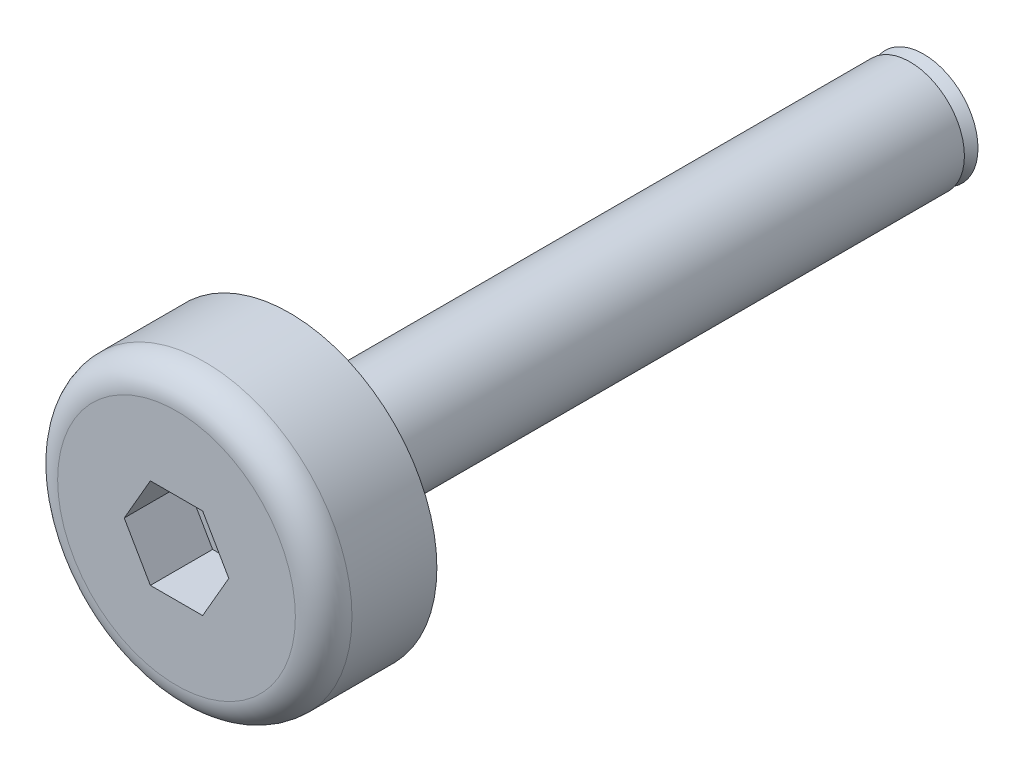
ISO-10303-21;
HEADER;
FILE_DESCRIPTION(('STEP AP214'),'2;1');
FILE_NAME('part.step','',(''),(''),'','','');
FILE_SCHEMA(('AUTOMOTIVE_DESIGN { 1 0 10303 214 1 1 1 1 }'));
ENDSEC;
DATA;
#1=APPLICATION_CONTEXT('core data for automotive mechanical design processes');
#2=APPLICATION_PROTOCOL_DEFINITION('international standard','automotive_design',2000,#1);
#3=PRODUCT_CONTEXT('',#1,'mechanical');
#4=PRODUCT('Part','Part','',(#3));
#5=PRODUCT_RELATED_PRODUCT_CATEGORY('part','',(#4));
#6=PRODUCT_DEFINITION_FORMATION('','',#4);
#7=PRODUCT_DEFINITION_CONTEXT('part definition',#1,'design');
#8=PRODUCT_DEFINITION('design','',#6,#7);
#9=PRODUCT_DEFINITION_SHAPE('','',#8);
#10=(LENGTH_UNIT() NAMED_UNIT(*) SI_UNIT(.MILLI.,.METRE.));
#11=(NAMED_UNIT(*) PLANE_ANGLE_UNIT() SI_UNIT($,.RADIAN.));
#12=(NAMED_UNIT(*) SI_UNIT($,.STERADIAN.) SOLID_ANGLE_UNIT());
#13=UNCERTAINTY_MEASURE_WITH_UNIT(LENGTH_MEASURE(1.E-05),#10,'distance_accuracy_value','');
#14=(GEOMETRIC_REPRESENTATION_CONTEXT(3) GLOBAL_UNCERTAINTY_ASSIGNED_CONTEXT((#13)) GLOBAL_UNIT_ASSIGNED_CONTEXT((#10,
#11,#12)) REPRESENTATION_CONTEXT('',''));
#15=CARTESIAN_POINT('',(0.,0.,0.));
#16=DIRECTION('',(0.,0.,1.));
#17=DIRECTION('',(1.,0.,0.));
#18=AXIS2_PLACEMENT_3D('',#15,#16,#17);
#19=CARTESIAN_POINT('',(0.,0.,-14.));
#20=DIRECTION('',(0.,0.,1.));
#21=DIRECTION('',(1.,0.,0.));
#22=AXIS2_PLACEMENT_3D('',#19,#20,#21);
#23=PLANE('',#22);
#24=CARTESIAN_POINT('',(0.,0.,-14.));
#25=DIRECTION('',(0.,0.,1.));
#26=DIRECTION('',(1.,0.,0.));
#27=AXIS2_PLACEMENT_3D('',#24,#25,#26);
#28=CIRCLE('',#27,1.2);
#29=CARTESIAN_POINT('',(1.2,0.,-14.));
#30=VERTEX_POINT('',#29);
#31=EDGE_CURVE('E9',#30,#30,#28,.T.);
#32=ORIENTED_EDGE('',*,*,#31,.F.);
#33=EDGE_LOOP('',(#32));
#34=FACE_BOUND('',#33,.T.);
#35=ADVANCED_FACE('F14',(#34),#23,.F.);
#36=CARTESIAN_POINT('',(0.,0.,-14.));
#37=DIRECTION('',(0.,0.,-1.));
#38=DIRECTION('',(1.,0.,0.));
#39=AXIS2_PLACEMENT_3D('',#36,#37,#38);
#40=CONICAL_SURFACE('',#39,1.2,0.785398163397);
#41=CARTESIAN_POINT('',(0.,0.,-13.7));
#42=DIRECTION('',(0.,0.,1.));
#43=DIRECTION('',(1.,0.,0.));
#44=AXIS2_PLACEMENT_3D('',#41,#42,#43);
#45=CIRCLE('',#44,0.9);
#46=CARTESIAN_POINT('',(0.9,0.,-13.7));
#47=VERTEX_POINT('',#46);
#48=EDGE_CURVE('E148',#47,#47,#45,.T.);
#49=ORIENTED_EDGE('',*,*,#48,.F.);
#50=DIRECTION('',(-0.707106781186548,0.,0.707106781186548));
#51=VECTOR('',#50,1.);
#52=CARTESIAN_POINT('',(1.2,0.,-14.));
#53=LINE('',#52,#51);
#54=EDGE_CURVE('E25',#30,#47,#53,.T.);
#55=ORIENTED_EDGE('',*,*,#54,.F.);
#56=ORIENTED_EDGE('',*,*,#31,.T.);
#57=ORIENTED_EDGE('',*,*,#54,.T.);
#58=EDGE_LOOP('',(#49,#55,#56,#57));
#59=FACE_BOUND('',#58,.T.);
#60=ADVANCED_FACE('F262',(#59),#40,.T.);
#61=CARTESIAN_POINT('',(0.,0.,1.125));
#62=DIRECTION('',(0.,0.,1.));
#63=DIRECTION('',(1.,0.,0.));
#64=AXIS2_PLACEMENT_3D('',#61,#62,#63);
#65=PLANE('',#64);
#66=DIRECTION('',(-0.50000000000019,0.866025403784329,0.));
#67=VECTOR('',#66,1.);
#68=CARTESIAN_POINT('',(1.154700538379,0.,1.125));
#69=LINE('',#68,#67);
#70=CARTESIAN_POINT('',(1.154700538379,0.,1.125));
#71=VERTEX_POINT('',#70);
#72=CARTESIAN_POINT('',(0.57735026919,1.,1.125));
#73=VERTEX_POINT('',#72);
#74=EDGE_CURVE('E145',#71,#73,#69,.T.);
#75=ORIENTED_EDGE('',*,*,#74,.T.);
#76=DIRECTION('',(-1.,0.,0.));
#77=VECTOR('',#76,1.);
#78=CARTESIAN_POINT('',(0.57735026919,1.,1.125));
#79=LINE('',#78,#77);
#80=CARTESIAN_POINT('',(-0.57735026919,1.,1.125));
#81=VERTEX_POINT('',#80);
#82=EDGE_CURVE('E178',#73,#81,#79,.T.);
#83=ORIENTED_EDGE('',*,*,#82,.T.);
#84=DIRECTION('',(-0.50000000000019,-0.866025403784329,0.));
#85=VECTOR('',#84,1.);
#86=CARTESIAN_POINT('',(-0.57735026919,1.,1.125));
#87=LINE('',#86,#85);
#88=CARTESIAN_POINT('',(-1.154700538379,0.,1.125));
#89=VERTEX_POINT('',#88);
#90=EDGE_CURVE('E193',#81,#89,#87,.T.);
#91=ORIENTED_EDGE('',*,*,#90,.T.);
#92=DIRECTION('',(0.50000000000019,-0.866025403784329,0.));
#93=VECTOR('',#92,1.);
#94=CARTESIAN_POINT('',(-1.154700538379,0.,1.125));
#95=LINE('',#94,#93);
#96=CARTESIAN_POINT('',(-0.57735026919,-1.,1.125));
#97=VERTEX_POINT('',#96);
#98=EDGE_CURVE('E189',#89,#97,#95,.T.);
#99=ORIENTED_EDGE('',*,*,#98,.T.);
#100=DIRECTION('',(1.,0.,0.));
#101=VECTOR('',#100,1.);
#102=CARTESIAN_POINT('',(-0.57735026919,-1.,1.125));
#103=LINE('',#102,#101);
#104=CARTESIAN_POINT('',(0.57735026919,-1.,1.125));
#105=VERTEX_POINT('',#104);
#106=EDGE_CURVE('E117',#97,#105,#103,.T.);
#107=ORIENTED_EDGE('',*,*,#106,.T.);
#108=DIRECTION('',(0.50000000000019,0.866025403784329,0.));
#109=VECTOR('',#108,1.);
#110=CARTESIAN_POINT('',(0.57735026919,-1.,1.125));
#111=LINE('',#110,#109);
#112=EDGE_CURVE('E112',#105,#71,#111,.T.);
#113=ORIENTED_EDGE('',*,*,#112,.T.);
#114=EDGE_LOOP('',(#75,#83,#91,#99,#107,#113));
#115=FACE_BOUND('',#114,.T.);
#116=ADVANCED_FACE('F216',(#115),#65,.T.);
#117=CARTESIAN_POINT('',(0.,0.,-13.7));
#118=DIRECTION('',(0.,0.,1.));
#119=DIRECTION('',(1.,0.,0.));
#120=AXIS2_PLACEMENT_3D('',#117,#118,#119);
#121=PLANE('',#120);
#122=ORIENTED_EDGE('',*,*,#48,.T.);
#123=EDGE_LOOP('',(#122));
#124=FACE_BOUND('',#123,.T.);
#125=CARTESIAN_POINT('',(0.,0.,-13.7));
#126=DIRECTION('',(0.,0.,1.));
#127=DIRECTION('',(1.,0.,0.));
#128=AXIS2_PLACEMENT_3D('',#125,#126,#127);
#129=CIRCLE('',#128,1.2);
#130=CARTESIAN_POINT('',(1.2,0.,-13.7));
#131=VERTEX_POINT('',#130);
#132=EDGE_CURVE('E194',#131,#131,#129,.T.);
#133=ORIENTED_EDGE('',*,*,#132,.F.);
#134=EDGE_LOOP('',(#133));
#135=FACE_BOUND('',#134,.T.);
#136=ADVANCED_FACE('F272',(#124,#135),#121,.F.);
#137=CARTESIAN_POINT('',(1.154700538379,0.,1.125));
#138=DIRECTION('',(-0.866025403784329,-0.50000000000019,0.));
#139=DIRECTION('',(-0.50000000000019,0.866025403784329,0.));
#140=AXIS2_PLACEMENT_3D('',#137,#138,#139);
#141=PLANE('',#140);
#142=ORIENTED_EDGE('',*,*,#74,.F.);
#143=DIRECTION('',(0.,0.,1.));
#144=VECTOR('',#143,1.);
#145=CARTESIAN_POINT('',(1.154700538379,0.,1.125));
#146=LINE('',#145,#144);
#147=CARTESIAN_POINT('',(1.154700538379,0.,2.5));
#148=VERTEX_POINT('',#147);
#149=EDGE_CURVE('E143',#71,#148,#146,.T.);
#150=ORIENTED_EDGE('',*,*,#149,.T.);
#151=DIRECTION('',(0.50000000000019,-0.866025403784329,0.));
#152=VECTOR('',#151,1.);
#153=CARTESIAN_POINT('',(1.010362971082,0.25,2.5));
#154=LINE('',#153,#152);
#155=CARTESIAN_POINT('',(0.57735026919,1.,2.5));
#156=VERTEX_POINT('',#155);
#157=EDGE_CURVE('E134',#156,#148,#154,.T.);
#158=ORIENTED_EDGE('',*,*,#157,.F.);
#159=DIRECTION('',(0.,0.,1.));
#160=VECTOR('',#159,1.);
#161=CARTESIAN_POINT('',(0.57735026919,1.,1.125));
#162=LINE('',#161,#160);
#163=EDGE_CURVE('E174',#73,#156,#162,.T.);
#164=ORIENTED_EDGE('',*,*,#163,.F.);
#165=EDGE_LOOP('',(#142,#150,#158,#164));
#166=FACE_BOUND('',#165,.T.);
#167=ADVANCED_FACE('F281',(#166),#141,.T.);
#168=CARTESIAN_POINT('',(0.57735026919,-1.,1.125));
#169=DIRECTION('',(-0.866025403784329,0.50000000000019,0.));
#170=DIRECTION('',(0.,0.,1.));
#171=AXIS2_PLACEMENT_3D('',#168,#169,#170);
#172=PLANE('',#171);
#173=ORIENTED_EDGE('',*,*,#112,.F.);
#174=DIRECTION('',(0.,0.,1.));
#175=VECTOR('',#174,1.);
#176=CARTESIAN_POINT('',(0.57735026919,-1.,1.125));
#177=LINE('',#176,#175);
#178=CARTESIAN_POINT('',(0.57735026919,-1.,2.5));
#179=VERTEX_POINT('',#178);
#180=EDGE_CURVE('E104',#105,#179,#177,.T.);
#181=ORIENTED_EDGE('',*,*,#180,.T.);
#182=DIRECTION('',(-0.50000000000019,-0.866025403784329,0.));
#183=VECTOR('',#182,1.);
#184=CARTESIAN_POINT('',(0.721687836487,-0.75,2.5));
#185=LINE('',#184,#183);
#186=EDGE_CURVE('E109',#148,#179,#185,.T.);
#187=ORIENTED_EDGE('',*,*,#186,.F.);
#188=ORIENTED_EDGE('',*,*,#149,.F.);
#189=EDGE_LOOP('',(#173,#181,#187,#188));
#190=FACE_BOUND('',#189,.T.);
#191=ADVANCED_FACE('F106',(#190),#172,.T.);
#192=CARTESIAN_POINT('',(-0.57735026919,-1.,1.125));
#193=DIRECTION('',(0.,1.,0.));
#194=DIRECTION('',(1.,0.,0.));
#195=AXIS2_PLACEMENT_3D('',#192,#193,#194);
#196=PLANE('',#195);
#197=ORIENTED_EDGE('',*,*,#106,.F.);
#198=DIRECTION('',(0.,0.,1.));
#199=VECTOR('',#198,1.);
#200=CARTESIAN_POINT('',(-0.57735026919,-1.,1.125));
#201=LINE('',#200,#199);
#202=CARTESIAN_POINT('',(-0.57735026919,-1.,2.5));
#203=VERTEX_POINT('',#202);
#204=EDGE_CURVE('E123',#97,#203,#201,.T.);
#205=ORIENTED_EDGE('',*,*,#204,.T.);
#206=DIRECTION('',(-1.,0.,0.));
#207=VECTOR('',#206,1.);
#208=CARTESIAN_POINT('',(-0.288675134595,-1.,2.5));
#209=LINE('',#208,#207);
#210=EDGE_CURVE('E120',#179,#203,#209,.T.);
#211=ORIENTED_EDGE('',*,*,#210,.F.);
#212=ORIENTED_EDGE('',*,*,#180,.F.);
#213=EDGE_LOOP('',(#197,#205,#211,#212));
#214=FACE_BOUND('',#213,.T.);
#215=ADVANCED_FACE('F121',(#214),#196,.T.);
#216=CARTESIAN_POINT('',(-1.154700538379,0.,1.125));
#217=DIRECTION('',(0.866025403784329,0.50000000000019,0.));
#218=DIRECTION('',(0.,0.,-1.));
#219=AXIS2_PLACEMENT_3D('',#216,#217,#218);
#220=PLANE('',#219);
#221=ORIENTED_EDGE('',*,*,#98,.F.);
#222=DIRECTION('',(0.,0.,1.));
#223=VECTOR('',#222,1.);
#224=CARTESIAN_POINT('',(-1.154700538379,0.,1.125));
#225=LINE('',#224,#223);
#226=CARTESIAN_POINT('',(-1.154700538379,0.,2.5));
#227=VERTEX_POINT('',#226);
#228=EDGE_CURVE('E190',#89,#227,#225,.T.);
#229=ORIENTED_EDGE('',*,*,#228,.T.);
#230=DIRECTION('',(-0.50000000000019,0.866025403784329,0.));
#231=VECTOR('',#230,1.);
#232=CARTESIAN_POINT('',(-1.010362971082,-0.25,2.5));
#233=LINE('',#232,#231);
#234=EDGE_CURVE('E128',#203,#227,#233,.T.);
#235=ORIENTED_EDGE('',*,*,#234,.F.);
#236=ORIENTED_EDGE('',*,*,#204,.F.);
#237=EDGE_LOOP('',(#221,#229,#235,#236));
#238=FACE_BOUND('',#237,.T.);
#239=ADVANCED_FACE('F274',(#238),#220,.T.);
#240=CARTESIAN_POINT('',(-0.57735026919,1.,1.125));
#241=DIRECTION('',(0.866025403784329,-0.50000000000019,0.));
#242=DIRECTION('',(0.,0.,-1.));
#243=AXIS2_PLACEMENT_3D('',#240,#241,#242);
#244=PLANE('',#243);
#245=ORIENTED_EDGE('',*,*,#90,.F.);
#246=DIRECTION('',(0.,0.,1.));
#247=VECTOR('',#246,1.);
#248=CARTESIAN_POINT('',(-0.57735026919,1.,1.125));
#249=LINE('',#248,#247);
#250=CARTESIAN_POINT('',(-0.57735026919,1.,2.5));
#251=VERTEX_POINT('',#250);
#252=EDGE_CURVE('E177',#81,#251,#249,.T.);
#253=ORIENTED_EDGE('',*,*,#252,.T.);
#254=DIRECTION('',(0.50000000000019,0.866025403784329,0.));
#255=VECTOR('',#254,1.);
#256=CARTESIAN_POINT('',(-0.721687836487,0.75,2.5));
#257=LINE('',#256,#255);
#258=EDGE_CURVE('E181',#227,#251,#257,.T.);
#259=ORIENTED_EDGE('',*,*,#258,.F.);
#260=ORIENTED_EDGE('',*,*,#228,.F.);
#261=EDGE_LOOP('',(#245,#253,#259,#260));
#262=FACE_BOUND('',#261,.T.);
#263=ADVANCED_FACE('F225',(#262),#244,.T.);
#264=CARTESIAN_POINT('',(0.57735026919,1.,1.125));
#265=DIRECTION('',(0.,-1.,0.));
#266=DIRECTION('',(-1.,0.,0.));
#267=AXIS2_PLACEMENT_3D('',#264,#265,#266);
#268=PLANE('',#267);
#269=ORIENTED_EDGE('',*,*,#82,.F.);
#270=ORIENTED_EDGE('',*,*,#163,.T.);
#271=DIRECTION('',(1.,0.,0.));
#272=VECTOR('',#271,1.);
#273=CARTESIAN_POINT('',(0.288675134595,1.,2.5));
#274=LINE('',#273,#272);
#275=EDGE_CURVE('E18',#251,#156,#274,.T.);
#276=ORIENTED_EDGE('',*,*,#275,.F.);
#277=ORIENTED_EDGE('',*,*,#252,.F.);
#278=EDGE_LOOP('',(#269,#270,#276,#277));
#279=FACE_BOUND('',#278,.T.);
#280=ADVANCED_FACE('F16',(#279),#268,.T.);
#281=CARTESIAN_POINT('',(0.,0.,-13.7));
#282=DIRECTION('',(0.,0.,1.));
#283=DIRECTION('',(1.,0.,0.));
#284=AXIS2_PLACEMENT_3D('',#281,#282,#283);
#285=CYLINDRICAL_SURFACE('',#284,1.2);
#286=CARTESIAN_POINT('',(0.,0.,0.));
#287=DIRECTION('',(0.,0.,1.));
#288=DIRECTION('',(1.,0.,0.));
#289=AXIS2_PLACEMENT_3D('',#286,#287,#288);
#290=CIRCLE('',#289,1.2);
#291=CARTESIAN_POINT('',(1.2,0.,0.));
#292=VERTEX_POINT('',#291);
#293=EDGE_CURVE('E185',#292,#292,#290,.T.);
#294=ORIENTED_EDGE('',*,*,#293,.F.);
#295=DIRECTION('',(0.,0.,1.));
#296=VECTOR('',#295,1.);
#297=CARTESIAN_POINT('',(1.2,0.,-13.7));
#298=LINE('',#297,#296);
#299=EDGE_CURVE('E197',#131,#292,#298,.T.);
#300=ORIENTED_EDGE('',*,*,#299,.F.);
#301=ORIENTED_EDGE('',*,*,#132,.T.);
#302=ORIENTED_EDGE('',*,*,#299,.T.);
#303=EDGE_LOOP('',(#294,#300,#301,#302));
#304=FACE_BOUND('',#303,.T.);
#305=ADVANCED_FACE('F257',(#304),#285,.T.);
#306=CARTESIAN_POINT('',(0.,0.,2.5));
#307=DIRECTION('',(0.,0.,1.));
#308=DIRECTION('',(1.,0.,0.));
#309=AXIS2_PLACEMENT_3D('',#306,#307,#308);
#310=PLANE('',#309);
#311=ORIENTED_EDGE('',*,*,#275,.T.);
#312=ORIENTED_EDGE('',*,*,#157,.T.);
#313=ORIENTED_EDGE('',*,*,#186,.T.);
#314=ORIENTED_EDGE('',*,*,#210,.T.);
#315=ORIENTED_EDGE('',*,*,#234,.T.);
#316=ORIENTED_EDGE('',*,*,#258,.T.);
#317=EDGE_LOOP('',(#311,#312,#313,#314,#315,#316));
#318=FACE_BOUND('',#317,.T.);
#319=CARTESIAN_POINT('',(0.,0.,2.5));
#320=DIRECTION('',(0.,0.,1.));
#321=DIRECTION('',(1.,0.,0.));
#322=AXIS2_PLACEMENT_3D('',#319,#320,#321);
#323=CIRCLE('',#322,2.625);
#324=CARTESIAN_POINT('',(2.625,0.,2.5));
#325=VERTEX_POINT('',#324);
#326=EDGE_CURVE('E158',#325,#325,#323,.T.);
#327=ORIENTED_EDGE('',*,*,#326,.T.);
#328=EDGE_LOOP('',(#327));
#329=FACE_BOUND('',#328,.T.);
#330=ADVANCED_FACE('F131',(#318,#329),#310,.T.);
#331=CARTESIAN_POINT('',(0.,0.,0.));
#332=DIRECTION('',(0.,0.,1.));
#333=DIRECTION('',(1.,0.,0.));
#334=AXIS2_PLACEMENT_3D('',#331,#332,#333);
#335=PLANE('',#334);
#336=ORIENTED_EDGE('',*,*,#293,.T.);
#337=EDGE_LOOP('',(#336));
#338=FACE_BOUND('',#337,.T.);
#339=CARTESIAN_POINT('',(0.,0.,0.));
#340=DIRECTION('',(0.,0.,1.));
#341=DIRECTION('',(1.,0.,0.));
#342=AXIS2_PLACEMENT_3D('',#339,#340,#341);
#343=CIRCLE('',#342,3.25);
#344=CARTESIAN_POINT('',(3.25,0.,0.));
#345=VERTEX_POINT('',#344);
#346=EDGE_CURVE('E151',#345,#345,#343,.T.);
#347=ORIENTED_EDGE('',*,*,#346,.F.);
#348=EDGE_LOOP('',(#347));
#349=FACE_BOUND('',#348,.T.);
#350=ADVANCED_FACE('F246',(#338,#349),#335,.F.);
#351=CARTESIAN_POINT('',(0.,0.,1.875));
#352=DIRECTION('',(0.,0.,1.));
#353=DIRECTION('',(1.,0.,0.));
#354=AXIS2_PLACEMENT_3D('',#351,#352,#353);
#355=TOROIDAL_SURFACE('',#354,2.625,0.625);
#356=CARTESIAN_POINT('',(2.625,0.,1.875));
#357=DIRECTION('',(0.,-1.,0.));
#358=DIRECTION('',(1.,0.,0.));
#359=AXIS2_PLACEMENT_3D('',#356,#357,#358);
#360=CIRCLE('',#359,0.625);
#361=CARTESIAN_POINT('',(3.25,0.,1.875));
#362=VERTEX_POINT('',#361);
#363=EDGE_CURVE('E154',#362,#325,#360,.T.);
#364=ORIENTED_EDGE('',*,*,#363,.F.);
#365=CARTESIAN_POINT('',(0.,0.,1.875));
#366=DIRECTION('',(0.,0.,1.));
#367=DIRECTION('',(1.,0.,0.));
#368=AXIS2_PLACEMENT_3D('',#365,#366,#367);
#369=CIRCLE('',#368,3.25);
#370=EDGE_CURVE('E155',#362,#362,#369,.T.);
#371=ORIENTED_EDGE('',*,*,#370,.T.);
#372=ORIENTED_EDGE('',*,*,#363,.T.);
#373=ORIENTED_EDGE('',*,*,#326,.F.);
#374=EDGE_LOOP('',(#364,#371,#372,#373));
#375=FACE_BOUND('',#374,.T.);
#376=ADVANCED_FACE('F248',(#375),#355,.T.);
#377=CARTESIAN_POINT('',(0.,0.,0.));
#378=DIRECTION('',(0.,0.,1.));
#379=DIRECTION('',(1.,0.,0.));
#380=AXIS2_PLACEMENT_3D('',#377,#378,#379);
#381=CYLINDRICAL_SURFACE('',#380,3.25);
#382=DIRECTION('',(0.,0.,1.));
#383=VECTOR('',#382,1.);
#384=CARTESIAN_POINT('',(3.25,0.,0.));
#385=LINE('',#384,#383);
#386=EDGE_CURVE('E172',#345,#362,#385,.T.);
#387=ORIENTED_EDGE('',*,*,#386,.T.);
#388=ORIENTED_EDGE('',*,*,#370,.F.);
#389=ORIENTED_EDGE('',*,*,#386,.F.);
#390=ORIENTED_EDGE('',*,*,#346,.T.);
#391=EDGE_LOOP('',(#387,#388,#389,#390));
#392=FACE_BOUND('',#391,.T.);
#393=ADVANCED_FACE('F243',(#392),#381,.T.);
#394=CLOSED_SHELL('',(#35,#60,#116,#136,#167,#191,#215,#239,#263,#280,#305,#330,#350,#376,#393));
#395=MANIFOLD_SOLID_BREP('B1',#394);
#396=ADVANCED_BREP_SHAPE_REPRESENTATION('',(#18,#395),#14);
#397=SHAPE_DEFINITION_REPRESENTATION(#9,#396);
ENDSEC;
END-ISO-10303-21;
